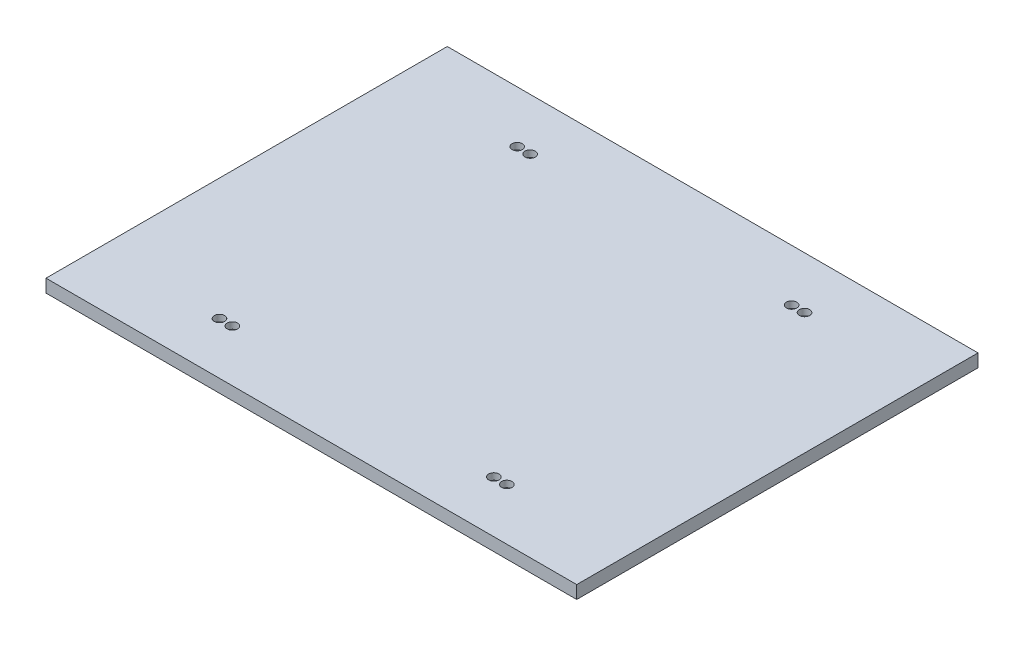
ISO-10303-21;
HEADER;
FILE_DESCRIPTION(('STEP AP214'),'2;1');
FILE_NAME('part.step','',(''),(''),'','','');
FILE_SCHEMA(('AUTOMOTIVE_DESIGN { 1 0 10303 214 1 1 1 1 }'));
ENDSEC;
DATA;
#1=APPLICATION_CONTEXT('core data for automotive mechanical design processes');
#2=APPLICATION_PROTOCOL_DEFINITION('international standard','automotive_design',2000,#1);
#3=PRODUCT_CONTEXT('',#1,'mechanical');
#4=PRODUCT('Part','Part','',(#3));
#5=PRODUCT_RELATED_PRODUCT_CATEGORY('part','',(#4));
#6=PRODUCT_DEFINITION_FORMATION('','',#4);
#7=PRODUCT_DEFINITION_CONTEXT('part definition',#1,'design');
#8=PRODUCT_DEFINITION('design','',#6,#7);
#9=PRODUCT_DEFINITION_SHAPE('','',#8);
#10=(LENGTH_UNIT() NAMED_UNIT(*) SI_UNIT(.MILLI.,.METRE.));
#11=(NAMED_UNIT(*) PLANE_ANGLE_UNIT() SI_UNIT($,.RADIAN.));
#12=(NAMED_UNIT(*) SI_UNIT($,.STERADIAN.) SOLID_ANGLE_UNIT());
#13=UNCERTAINTY_MEASURE_WITH_UNIT(LENGTH_MEASURE(1.E-05),#10,'distance_accuracy_value','');
#14=(GEOMETRIC_REPRESENTATION_CONTEXT(3) GLOBAL_UNCERTAINTY_ASSIGNED_CONTEXT((#13)) GLOBAL_UNIT_ASSIGNED_CONTEXT((#10,
#11,#12)) REPRESENTATION_CONTEXT('',''));
#15=CARTESIAN_POINT('',(0.,0.,0.));
#16=DIRECTION('',(0.,0.,1.));
#17=DIRECTION('',(1.,0.,0.));
#18=AXIS2_PLACEMENT_3D('',#15,#16,#17);
#19=CARTESIAN_POINT('',(94.,0.,-40.));
#20=DIRECTION('',(0.,1.,0.));
#21=DIRECTION('',(0.,0.,1.));
#22=AXIS2_PLACEMENT_3D('',#19,#20,#21);
#23=CYLINDRICAL_SURFACE('',#22,2.);
#24=CARTESIAN_POINT('',(94.,0.,-40.));
#25=DIRECTION('',(0.,1.,0.));
#26=DIRECTION('',(0.,0.,1.));
#27=AXIS2_PLACEMENT_3D('',#24,#25,#26);
#28=CIRCLE('',#27,2.);
#29=CARTESIAN_POINT('',(94.,0.,-38.));
#30=VERTEX_POINT('',#29);
#31=EDGE_CURVE('E612',#30,#30,#28,.T.);
#32=ORIENTED_EDGE('',*,*,#31,.F.);
#33=EDGE_LOOP('',(#32));
#34=FACE_BOUND('',#33,.T.);
#35=CARTESIAN_POINT('',(94.,5.,-40.));
#36=DIRECTION('',(0.,1.,0.));
#37=DIRECTION('',(0.,0.,1.));
#38=AXIS2_PLACEMENT_3D('',#35,#36,#37);
#39=CIRCLE('',#38,2.);
#40=CARTESIAN_POINT('',(94.,5.,-38.));
#41=VERTEX_POINT('',#40);
#42=EDGE_CURVE('E537',#41,#41,#39,.F.);
#43=ORIENTED_EDGE('',*,*,#42,.F.);
#44=EDGE_LOOP('',(#43));
#45=FACE_BOUND('',#44,.T.);
#46=ADVANCED_FACE('F532',(#34,#45),#23,.F.);
#47=CARTESIAN_POINT('',(94.,0.,-270.));
#48=DIRECTION('',(0.,1.,0.));
#49=DIRECTION('',(0.,0.,1.));
#50=AXIS2_PLACEMENT_3D('',#47,#48,#49);
#51=CYLINDRICAL_SURFACE('',#50,2.);
#52=CARTESIAN_POINT('',(94.,0.,-270.));
#53=DIRECTION('',(0.,1.,0.));
#54=DIRECTION('',(0.,0.,1.));
#55=AXIS2_PLACEMENT_3D('',#52,#53,#54);
#56=CIRCLE('',#55,2.);
#57=CARTESIAN_POINT('',(94.,0.,-268.));
#58=VERTEX_POINT('',#57);
#59=EDGE_CURVE('E654',#58,#58,#56,.T.);
#60=ORIENTED_EDGE('',*,*,#59,.F.);
#61=EDGE_LOOP('',(#60));
#62=FACE_BOUND('',#61,.T.);
#63=CARTESIAN_POINT('',(94.,5.,-270.));
#64=DIRECTION('',(0.,1.,0.));
#65=DIRECTION('',(0.,0.,1.));
#66=AXIS2_PLACEMENT_3D('',#63,#64,#65);
#67=CIRCLE('',#66,2.);
#68=CARTESIAN_POINT('',(94.,5.,-268.));
#69=VERTEX_POINT('',#68);
#70=EDGE_CURVE('E650',#69,#69,#67,.F.);
#71=ORIENTED_EDGE('',*,*,#70,.F.);
#72=EDGE_LOOP('',(#71));
#73=FACE_BOUND('',#72,.T.);
#74=ADVANCED_FACE('F810',(#62,#73),#51,.F.);
#75=CARTESIAN_POINT('',(104.,0.,-270.));
#76=DIRECTION('',(0.,1.,0.));
#77=DIRECTION('',(0.,0.,1.));
#78=AXIS2_PLACEMENT_3D('',#75,#76,#77);
#79=CYLINDRICAL_SURFACE('',#78,2.);
#80=CARTESIAN_POINT('',(104.,0.,-270.));
#81=DIRECTION('',(0.,1.,0.));
#82=DIRECTION('',(0.,0.,1.));
#83=AXIS2_PLACEMENT_3D('',#80,#81,#82);
#84=CIRCLE('',#83,2.);
#85=CARTESIAN_POINT('',(104.,0.,-268.));
#86=VERTEX_POINT('',#85);
#87=EDGE_CURVE('E662',#86,#86,#84,.T.);
#88=ORIENTED_EDGE('',*,*,#87,.F.);
#89=EDGE_LOOP('',(#88));
#90=FACE_BOUND('',#89,.T.);
#91=CARTESIAN_POINT('',(104.,5.,-270.));
#92=DIRECTION('',(0.,1.,0.));
#93=DIRECTION('',(0.,0.,1.));
#94=AXIS2_PLACEMENT_3D('',#91,#92,#93);
#95=CIRCLE('',#94,2.);
#96=CARTESIAN_POINT('',(104.,5.,-268.));
#97=VERTEX_POINT('',#96);
#98=EDGE_CURVE('E644',#97,#97,#95,.F.);
#99=ORIENTED_EDGE('',*,*,#98,.F.);
#100=EDGE_LOOP('',(#99));
#101=FACE_BOUND('',#100,.T.);
#102=ADVANCED_FACE('F812',(#90,#101),#79,.F.);
#103=CARTESIAN_POINT('',(306.,0.,-270.));
#104=DIRECTION('',(0.,1.,0.));
#105=DIRECTION('',(0.,0.,1.));
#106=AXIS2_PLACEMENT_3D('',#103,#104,#105);
#107=CYLINDRICAL_SURFACE('',#106,2.);
#108=CARTESIAN_POINT('',(306.,0.,-270.));
#109=DIRECTION('',(0.,1.,0.));
#110=DIRECTION('',(0.,0.,1.));
#111=AXIS2_PLACEMENT_3D('',#108,#109,#110);
#112=CIRCLE('',#111,2.);
#113=CARTESIAN_POINT('',(306.,0.,-268.));
#114=VERTEX_POINT('',#113);
#115=EDGE_CURVE('E669',#114,#114,#112,.T.);
#116=ORIENTED_EDGE('',*,*,#115,.F.);
#117=EDGE_LOOP('',(#116));
#118=FACE_BOUND('',#117,.T.);
#119=CARTESIAN_POINT('',(306.,5.,-270.));
#120=DIRECTION('',(0.,1.,0.));
#121=DIRECTION('',(0.,0.,1.));
#122=AXIS2_PLACEMENT_3D('',#119,#120,#121);
#123=CIRCLE('',#122,2.);
#124=CARTESIAN_POINT('',(306.,5.,-268.));
#125=VERTEX_POINT('',#124);
#126=EDGE_CURVE('E639',#125,#125,#123,.F.);
#127=ORIENTED_EDGE('',*,*,#126,.F.);
#128=EDGE_LOOP('',(#127));
#129=FACE_BOUND('',#128,.T.);
#130=ADVANCED_FACE('F857',(#118,#129),#107,.F.);
#131=CARTESIAN_POINT('',(316.,0.,-270.));
#132=DIRECTION('',(0.,1.,0.));
#133=DIRECTION('',(0.,0.,1.));
#134=AXIS2_PLACEMENT_3D('',#131,#132,#133);
#135=CYLINDRICAL_SURFACE('',#134,2.);
#136=CARTESIAN_POINT('',(316.,0.,-270.));
#137=DIRECTION('',(0.,1.,0.));
#138=DIRECTION('',(0.,0.,1.));
#139=AXIS2_PLACEMENT_3D('',#136,#137,#138);
#140=CIRCLE('',#139,2.);
#141=CARTESIAN_POINT('',(316.,0.,-268.));
#142=VERTEX_POINT('',#141);
#143=EDGE_CURVE('E685',#142,#142,#140,.T.);
#144=ORIENTED_EDGE('',*,*,#143,.F.);
#145=EDGE_LOOP('',(#144));
#146=FACE_BOUND('',#145,.T.);
#147=CARTESIAN_POINT('',(316.,5.,-270.));
#148=DIRECTION('',(0.,1.,0.));
#149=DIRECTION('',(0.,0.,1.));
#150=AXIS2_PLACEMENT_3D('',#147,#148,#149);
#151=CIRCLE('',#150,2.);
#152=CARTESIAN_POINT('',(316.,5.,-268.));
#153=VERTEX_POINT('',#152);
#154=EDGE_CURVE('E638',#153,#153,#151,.F.);
#155=ORIENTED_EDGE('',*,*,#154,.F.);
#156=EDGE_LOOP('',(#155));
#157=FACE_BOUND('',#156,.T.);
#158=ADVANCED_FACE('F819',(#146,#157),#135,.F.);
#159=CARTESIAN_POINT('',(316.,0.,-40.));
#160=DIRECTION('',(0.,1.,0.));
#161=DIRECTION('',(0.,0.,1.));
#162=AXIS2_PLACEMENT_3D('',#159,#160,#161);
#163=CYLINDRICAL_SURFACE('',#162,2.);
#164=CARTESIAN_POINT('',(316.,0.,-40.));
#165=DIRECTION('',(0.,1.,0.));
#166=DIRECTION('',(0.,0.,1.));
#167=AXIS2_PLACEMENT_3D('',#164,#165,#166);
#168=CIRCLE('',#167,2.);
#169=CARTESIAN_POINT('',(316.,0.,-38.));
#170=VERTEX_POINT('',#169);
#171=EDGE_CURVE('E678',#170,#170,#168,.T.);
#172=ORIENTED_EDGE('',*,*,#171,.F.);
#173=EDGE_LOOP('',(#172));
#174=FACE_BOUND('',#173,.T.);
#175=CARTESIAN_POINT('',(316.,5.,-40.));
#176=DIRECTION('',(0.,1.,0.));
#177=DIRECTION('',(0.,0.,1.));
#178=AXIS2_PLACEMENT_3D('',#175,#176,#177);
#179=CIRCLE('',#178,2.);
#180=CARTESIAN_POINT('',(316.,5.,-38.));
#181=VERTEX_POINT('',#180);
#182=EDGE_CURVE('E635',#181,#181,#179,.F.);
#183=ORIENTED_EDGE('',*,*,#182,.F.);
#184=EDGE_LOOP('',(#183));
#185=FACE_BOUND('',#184,.T.);
#186=ADVANCED_FACE('F848',(#174,#185),#163,.F.);
#187=CARTESIAN_POINT('',(306.,0.,-40.));
#188=DIRECTION('',(0.,1.,0.));
#189=DIRECTION('',(0.,0.,1.));
#190=AXIS2_PLACEMENT_3D('',#187,#188,#189);
#191=CYLINDRICAL_SURFACE('',#190,2.);
#192=CARTESIAN_POINT('',(306.,0.,-40.));
#193=DIRECTION('',(0.,1.,0.));
#194=DIRECTION('',(0.,0.,1.));
#195=AXIS2_PLACEMENT_3D('',#192,#193,#194);
#196=CIRCLE('',#195,2.);
#197=CARTESIAN_POINT('',(306.,0.,-38.));
#198=VERTEX_POINT('',#197);
#199=EDGE_CURVE('E677',#198,#198,#196,.T.);
#200=ORIENTED_EDGE('',*,*,#199,.F.);
#201=EDGE_LOOP('',(#200));
#202=FACE_BOUND('',#201,.T.);
#203=CARTESIAN_POINT('',(306.,5.,-40.));
#204=DIRECTION('',(0.,1.,0.));
#205=DIRECTION('',(0.,0.,1.));
#206=AXIS2_PLACEMENT_3D('',#203,#204,#205);
#207=CIRCLE('',#206,2.);
#208=CARTESIAN_POINT('',(306.,5.,-38.));
#209=VERTEX_POINT('',#208);
#210=EDGE_CURVE('E629',#209,#209,#207,.F.);
#211=ORIENTED_EDGE('',*,*,#210,.F.);
#212=EDGE_LOOP('',(#211));
#213=FACE_BOUND('',#212,.T.);
#214=ADVANCED_FACE('F838',(#202,#213),#191,.F.);
#215=CARTESIAN_POINT('',(104.,0.,-40.));
#216=DIRECTION('',(0.,1.,0.));
#217=DIRECTION('',(0.,0.,1.));
#218=AXIS2_PLACEMENT_3D('',#215,#216,#217);
#219=CYLINDRICAL_SURFACE('',#218,2.);
#220=CARTESIAN_POINT('',(104.,0.,-40.));
#221=DIRECTION('',(0.,1.,0.));
#222=DIRECTION('',(0.,0.,1.));
#223=AXIS2_PLACEMENT_3D('',#220,#221,#222);
#224=CIRCLE('',#223,2.);
#225=CARTESIAN_POINT('',(104.,0.,-38.));
#226=VERTEX_POINT('',#225);
#227=EDGE_CURVE('E675',#226,#226,#224,.T.);
#228=ORIENTED_EDGE('',*,*,#227,.F.);
#229=EDGE_LOOP('',(#228));
#230=FACE_BOUND('',#229,.T.);
#231=CARTESIAN_POINT('',(104.,5.,-40.));
#232=DIRECTION('',(0.,1.,0.));
#233=DIRECTION('',(0.,0.,1.));
#234=AXIS2_PLACEMENT_3D('',#231,#232,#233);
#235=CIRCLE('',#234,2.);
#236=CARTESIAN_POINT('',(104.,5.,-38.));
#237=VERTEX_POINT('',#236);
#238=EDGE_CURVE('E621',#237,#237,#235,.F.);
#239=ORIENTED_EDGE('',*,*,#238,.F.);
#240=EDGE_LOOP('',(#239));
#241=FACE_BOUND('',#240,.T.);
#242=ADVANCED_FACE('F834',(#230,#241),#219,.F.);
#243=CARTESIAN_POINT('',(0.,10.,0.));
#244=DIRECTION('',(1.,0.,0.));
#245=DIRECTION('',(0.,0.,-1.));
#246=AXIS2_PLACEMENT_3D('',#243,#244,#245);
#247=PLANE('',#246);
#248=DIRECTION('',(0.,0.,1.));
#249=VECTOR('',#248,1.);
#250=CARTESIAN_POINT('',(0.,0.,0.));
#251=LINE('',#250,#249);
#252=CARTESIAN_POINT('',(0.,0.,-310.));
#253=VERTEX_POINT('',#252);
#254=CARTESIAN_POINT('',(0.,0.,0.));
#255=VERTEX_POINT('',#254);
#256=EDGE_CURVE('E609',#253,#255,#251,.T.);
#257=ORIENTED_EDGE('',*,*,#256,.T.);
#258=DIRECTION('',(0.,-1.,0.));
#259=VECTOR('',#258,1.);
#260=CARTESIAN_POINT('',(0.,10.,0.));
#261=LINE('',#260,#259);
#262=CARTESIAN_POINT('',(0.,10.,0.));
#263=VERTEX_POINT('',#262);
#264=EDGE_CURVE('E12',#263,#255,#261,.T.);
#265=ORIENTED_EDGE('',*,*,#264,.F.);
#266=DIRECTION('',(0.,0.,1.));
#267=VECTOR('',#266,1.);
#268=CARTESIAN_POINT('',(0.,10.,0.));
#269=LINE('',#268,#267);
#270=CARTESIAN_POINT('',(0.,10.,-310.));
#271=VERTEX_POINT('',#270);
#272=EDGE_CURVE('E587',#271,#263,#269,.T.);
#273=ORIENTED_EDGE('',*,*,#272,.F.);
#274=DIRECTION('',(0.,-1.,0.));
#275=VECTOR('',#274,1.);
#276=CARTESIAN_POINT('',(0.,10.,-310.));
#277=LINE('',#276,#275);
#278=EDGE_CURVE('E603',#271,#253,#277,.T.);
#279=ORIENTED_EDGE('',*,*,#278,.T.);
#280=EDGE_LOOP('',(#257,#265,#273,#279));
#281=FACE_BOUND('',#280,.T.);
#282=ADVANCED_FACE('F540',(#281),#247,.F.);
#283=CARTESIAN_POINT('',(0.,10.,0.));
#284=DIRECTION('',(0.,0.,-1.));
#285=DIRECTION('',(-1.,0.,0.));
#286=AXIS2_PLACEMENT_3D('',#283,#284,#285);
#287=PLANE('',#286);
#288=DIRECTION('',(1.,0.,0.));
#289=VECTOR('',#288,1.);
#290=CARTESIAN_POINT('',(0.,0.,0.));
#291=LINE('',#290,#289);
#292=CARTESIAN_POINT('',(410.,0.,0.));
#293=VERTEX_POINT('',#292);
#294=EDGE_CURVE('E594',#255,#293,#291,.T.);
#295=ORIENTED_EDGE('',*,*,#294,.T.);
#296=DIRECTION('',(0.,-1.,0.));
#297=VECTOR('',#296,1.);
#298=CARTESIAN_POINT('',(410.,10.,0.));
#299=LINE('',#298,#297);
#300=CARTESIAN_POINT('',(410.,10.,0.));
#301=VERTEX_POINT('',#300);
#302=EDGE_CURVE('E546',#301,#293,#299,.T.);
#303=ORIENTED_EDGE('',*,*,#302,.F.);
#304=DIRECTION('',(1.,0.,0.));
#305=VECTOR('',#304,1.);
#306=CARTESIAN_POINT('',(0.,10.,0.));
#307=LINE('',#306,#305);
#308=EDGE_CURVE('E584',#263,#301,#307,.T.);
#309=ORIENTED_EDGE('',*,*,#308,.F.);
#310=ORIENTED_EDGE('',*,*,#264,.T.);
#311=EDGE_LOOP('',(#295,#303,#309,#310));
#312=FACE_BOUND('',#311,.T.);
#313=ADVANCED_FACE('F592',(#312),#287,.F.);
#314=CARTESIAN_POINT('',(410.,10.,0.));
#315=DIRECTION('',(-1.,0.,0.));
#316=DIRECTION('',(0.,0.,1.));
#317=AXIS2_PLACEMENT_3D('',#314,#315,#316);
#318=PLANE('',#317);
#319=DIRECTION('',(0.,0.,-1.));
#320=VECTOR('',#319,1.);
#321=CARTESIAN_POINT('',(410.,0.,0.));
#322=LINE('',#321,#320);
#323=CARTESIAN_POINT('',(410.,0.,-310.));
#324=VERTEX_POINT('',#323);
#325=EDGE_CURVE('E574',#293,#324,#322,.T.);
#326=ORIENTED_EDGE('',*,*,#325,.T.);
#327=DIRECTION('',(0.,-1.,0.));
#328=VECTOR('',#327,1.);
#329=CARTESIAN_POINT('',(410.,10.,-310.));
#330=LINE('',#329,#328);
#331=CARTESIAN_POINT('',(410.,10.,-310.));
#332=VERTEX_POINT('',#331);
#333=EDGE_CURVE('E600',#332,#324,#330,.T.);
#334=ORIENTED_EDGE('',*,*,#333,.F.);
#335=DIRECTION('',(0.,0.,-1.));
#336=VECTOR('',#335,1.);
#337=CARTESIAN_POINT('',(410.,10.,0.));
#338=LINE('',#337,#336);
#339=EDGE_CURVE('E586',#301,#332,#338,.T.);
#340=ORIENTED_EDGE('',*,*,#339,.F.);
#341=ORIENTED_EDGE('',*,*,#302,.T.);
#342=EDGE_LOOP('',(#326,#334,#340,#341));
#343=FACE_BOUND('',#342,.T.);
#344=ADVANCED_FACE('F597',(#343),#318,.F.);
#345=CARTESIAN_POINT('',(0.,10.,-310.));
#346=DIRECTION('',(0.,0.,1.));
#347=DIRECTION('',(1.,0.,0.));
#348=AXIS2_PLACEMENT_3D('',#345,#346,#347);
#349=PLANE('',#348);
#350=DIRECTION('',(-1.,0.,0.));
#351=VECTOR('',#350,1.);
#352=CARTESIAN_POINT('',(0.,0.,-310.));
#353=LINE('',#352,#351);
#354=EDGE_CURVE('E578',#324,#253,#353,.T.);
#355=ORIENTED_EDGE('',*,*,#354,.T.);
#356=ORIENTED_EDGE('',*,*,#278,.F.);
#357=DIRECTION('',(-1.,0.,0.));
#358=VECTOR('',#357,1.);
#359=CARTESIAN_POINT('',(0.,10.,-310.));
#360=LINE('',#359,#358);
#361=EDGE_CURVE('E553',#332,#271,#360,.T.);
#362=ORIENTED_EDGE('',*,*,#361,.F.);
#363=ORIENTED_EDGE('',*,*,#333,.T.);
#364=EDGE_LOOP('',(#355,#356,#362,#363));
#365=FACE_BOUND('',#364,.T.);
#366=ADVANCED_FACE('F778',(#365),#349,.F.);
#367=CARTESIAN_POINT('',(0.,10.,0.));
#368=DIRECTION('',(0.,-1.,0.));
#369=DIRECTION('',(0.,0.,-1.));
#370=AXIS2_PLACEMENT_3D('',#367,#368,#369);
#371=PLANE('',#370);
#372=CARTESIAN_POINT('',(306.,10.,-40.));
#373=DIRECTION('',(0.,1.,0.));
#374=DIRECTION('',(0.,0.,1.));
#375=AXIS2_PLACEMENT_3D('',#372,#373,#374);
#376=CIRCLE('',#375,3.99999999999999);
#377=CARTESIAN_POINT('',(306.,10.,-36.));
#378=VERTEX_POINT('',#377);
#379=EDGE_CURVE('E739',#378,#378,#376,.T.);
#380=ORIENTED_EDGE('',*,*,#379,.F.);
#381=EDGE_LOOP('',(#380));
#382=FACE_BOUND('',#381,.T.);
#383=CARTESIAN_POINT('',(316.,10.,-270.));
#384=DIRECTION('',(0.,1.,0.));
#385=DIRECTION('',(0.,0.,1.));
#386=AXIS2_PLACEMENT_3D('',#383,#384,#385);
#387=CIRCLE('',#386,3.99999999999999);
#388=CARTESIAN_POINT('',(316.,10.,-266.));
#389=VERTEX_POINT('',#388);
#390=EDGE_CURVE('E722',#389,#389,#387,.T.);
#391=ORIENTED_EDGE('',*,*,#390,.F.);
#392=EDGE_LOOP('',(#391));
#393=FACE_BOUND('',#392,.T.);
#394=CARTESIAN_POINT('',(306.,10.,-270.));
#395=DIRECTION('',(0.,1.,0.));
#396=DIRECTION('',(0.,0.,1.));
#397=AXIS2_PLACEMENT_3D('',#394,#395,#396);
#398=CIRCLE('',#397,3.99999999999999);
#399=CARTESIAN_POINT('',(306.,10.,-266.));
#400=VERTEX_POINT('',#399);
#401=EDGE_CURVE('E721',#400,#400,#398,.T.);
#402=ORIENTED_EDGE('',*,*,#401,.F.);
#403=EDGE_LOOP('',(#402));
#404=FACE_BOUND('',#403,.T.);
#405=CARTESIAN_POINT('',(104.,10.,-270.));
#406=DIRECTION('',(0.,1.,0.));
#407=DIRECTION('',(0.,0.,1.));
#408=AXIS2_PLACEMENT_3D('',#405,#406,#407);
#409=CIRCLE('',#408,4.00000000000001);
#410=CARTESIAN_POINT('',(104.,10.,-266.));
#411=VERTEX_POINT('',#410);
#412=EDGE_CURVE('E712',#411,#411,#409,.T.);
#413=ORIENTED_EDGE('',*,*,#412,.F.);
#414=EDGE_LOOP('',(#413));
#415=FACE_BOUND('',#414,.T.);
#416=CARTESIAN_POINT('',(104.,10.,-40.));
#417=DIRECTION('',(0.,1.,0.));
#418=DIRECTION('',(0.,0.,1.));
#419=AXIS2_PLACEMENT_3D('',#416,#417,#418);
#420=CIRCLE('',#419,4.00000000000001);
#421=CARTESIAN_POINT('',(104.,10.,-36.));
#422=VERTEX_POINT('',#421);
#423=EDGE_CURVE('E754',#422,#422,#420,.T.);
#424=ORIENTED_EDGE('',*,*,#423,.F.);
#425=EDGE_LOOP('',(#424));
#426=FACE_BOUND('',#425,.T.);
#427=CARTESIAN_POINT('',(94.,10.,-40.));
#428=DIRECTION('',(0.,1.,0.));
#429=DIRECTION('',(0.,0.,1.));
#430=AXIS2_PLACEMENT_3D('',#427,#428,#429);
#431=CIRCLE('',#430,4.00000000000001);
#432=CARTESIAN_POINT('',(94.,10.,-36.));
#433=VERTEX_POINT('',#432);
#434=EDGE_CURVE('E751',#433,#433,#431,.T.);
#435=ORIENTED_EDGE('',*,*,#434,.F.);
#436=EDGE_LOOP('',(#435));
#437=FACE_BOUND('',#436,.T.);
#438=CARTESIAN_POINT('',(316.,10.,-40.));
#439=DIRECTION('',(0.,1.,0.));
#440=DIRECTION('',(0.,0.,1.));
#441=AXIS2_PLACEMENT_3D('',#438,#439,#440);
#442=CIRCLE('',#441,3.99999999999999);
#443=CARTESIAN_POINT('',(316.,10.,-36.));
#444=VERTEX_POINT('',#443);
#445=EDGE_CURVE('E737',#444,#444,#442,.T.);
#446=ORIENTED_EDGE('',*,*,#445,.F.);
#447=EDGE_LOOP('',(#446));
#448=FACE_BOUND('',#447,.T.);
#449=CARTESIAN_POINT('',(94.,10.,-270.));
#450=DIRECTION('',(0.,1.,0.));
#451=DIRECTION('',(0.,0.,1.));
#452=AXIS2_PLACEMENT_3D('',#449,#450,#451);
#453=CIRCLE('',#452,4.00000000000001);
#454=CARTESIAN_POINT('',(94.,10.,-266.));
#455=VERTEX_POINT('',#454);
#456=EDGE_CURVE('E707',#455,#455,#453,.T.);
#457=ORIENTED_EDGE('',*,*,#456,.F.);
#458=EDGE_LOOP('',(#457));
#459=FACE_BOUND('',#458,.T.);
#460=ORIENTED_EDGE('',*,*,#272,.T.);
#461=ORIENTED_EDGE('',*,*,#308,.T.);
#462=ORIENTED_EDGE('',*,*,#339,.T.);
#463=ORIENTED_EDGE('',*,*,#361,.T.);
#464=EDGE_LOOP('',(#460,#461,#462,#463));
#465=FACE_BOUND('',#464,.T.);
#466=ADVANCED_FACE('F588',(#382,#393,#404,#415,#426,#437,#448,#459,#465),#371,.F.);
#467=CARTESIAN_POINT('',(0.,0.,0.));
#468=DIRECTION('',(0.,-1.,0.));
#469=DIRECTION('',(0.,0.,-1.));
#470=AXIS2_PLACEMENT_3D('',#467,#468,#469);
#471=PLANE('',#470);
#472=ORIENTED_EDGE('',*,*,#227,.T.);
#473=EDGE_LOOP('',(#472));
#474=FACE_BOUND('',#473,.T.);
#475=ORIENTED_EDGE('',*,*,#199,.T.);
#476=EDGE_LOOP('',(#475));
#477=FACE_BOUND('',#476,.T.);
#478=ORIENTED_EDGE('',*,*,#171,.T.);
#479=EDGE_LOOP('',(#478));
#480=FACE_BOUND('',#479,.T.);
#481=ORIENTED_EDGE('',*,*,#143,.T.);
#482=EDGE_LOOP('',(#481));
#483=FACE_BOUND('',#482,.T.);
#484=ORIENTED_EDGE('',*,*,#115,.T.);
#485=EDGE_LOOP('',(#484));
#486=FACE_BOUND('',#485,.T.);
#487=ORIENTED_EDGE('',*,*,#87,.T.);
#488=EDGE_LOOP('',(#487));
#489=FACE_BOUND('',#488,.T.);
#490=ORIENTED_EDGE('',*,*,#59,.T.);
#491=EDGE_LOOP('',(#490));
#492=FACE_BOUND('',#491,.T.);
#493=ORIENTED_EDGE('',*,*,#31,.T.);
#494=EDGE_LOOP('',(#493));
#495=FACE_BOUND('',#494,.T.);
#496=ORIENTED_EDGE('',*,*,#256,.F.);
#497=ORIENTED_EDGE('',*,*,#354,.F.);
#498=ORIENTED_EDGE('',*,*,#325,.F.);
#499=ORIENTED_EDGE('',*,*,#294,.F.);
#500=EDGE_LOOP('',(#496,#497,#498,#499));
#501=FACE_BOUND('',#500,.T.);
#502=ADVANCED_FACE('F779',(#474,#477,#480,#483,#486,#489,#492,#495,#501),#471,.T.);
#503=CARTESIAN_POINT('',(104.,5.,-40.));
#504=DIRECTION('',(0.,1.,0.));
#505=DIRECTION('',(0.,0.,1.));
#506=AXIS2_PLACEMENT_3D('',#503,#504,#505);
#507=PLANE('',#506);
#508=CARTESIAN_POINT('',(104.,5.,-40.));
#509=DIRECTION('',(0.,1.,0.));
#510=DIRECTION('',(0.,0.,1.));
#511=AXIS2_PLACEMENT_3D('',#508,#509,#510);
#512=CIRCLE('',#511,4.00000000000001);
#513=CARTESIAN_POINT('',(104.,5.,-36.));
#514=VERTEX_POINT('',#513);
#515=EDGE_CURVE('E764',#514,#514,#512,.T.);
#516=ORIENTED_EDGE('',*,*,#515,.T.);
#517=EDGE_LOOP('',(#516));
#518=FACE_BOUND('',#517,.T.);
#519=ORIENTED_EDGE('',*,*,#238,.T.);
#520=EDGE_LOOP('',(#519));
#521=FACE_BOUND('',#520,.T.);
#522=ADVANCED_FACE('F823',(#518,#521),#507,.T.);
#523=CARTESIAN_POINT('',(104.,5.,-40.));
#524=DIRECTION('',(0.,1.,0.));
#525=DIRECTION('',(0.,0.,1.));
#526=AXIS2_PLACEMENT_3D('',#523,#524,#525);
#527=CYLINDRICAL_SURFACE('',#526,4.00000000000001);
#528=ORIENTED_EDGE('',*,*,#515,.F.);
#529=EDGE_LOOP('',(#528));
#530=FACE_BOUND('',#529,.T.);
#531=ORIENTED_EDGE('',*,*,#423,.T.);
#532=EDGE_LOOP('',(#531));
#533=FACE_BOUND('',#532,.T.);
#534=ADVANCED_FACE('F771',(#530,#533),#527,.F.);
#535=CARTESIAN_POINT('',(306.,5.,-40.));
#536=DIRECTION('',(0.,1.,0.));
#537=DIRECTION('',(0.,0.,1.));
#538=AXIS2_PLACEMENT_3D('',#535,#536,#537);
#539=PLANE('',#538);
#540=CARTESIAN_POINT('',(306.,5.,-40.));
#541=DIRECTION('',(0.,1.,0.));
#542=DIRECTION('',(0.,0.,1.));
#543=AXIS2_PLACEMENT_3D('',#540,#541,#542);
#544=CIRCLE('',#543,3.99999999999999);
#545=CARTESIAN_POINT('',(306.,5.,-36.));
#546=VERTEX_POINT('',#545);
#547=EDGE_CURVE('E731',#546,#546,#544,.T.);
#548=ORIENTED_EDGE('',*,*,#547,.T.);
#549=EDGE_LOOP('',(#548));
#550=FACE_BOUND('',#549,.T.);
#551=ORIENTED_EDGE('',*,*,#210,.T.);
#552=EDGE_LOOP('',(#551));
#553=FACE_BOUND('',#552,.T.);
#554=ADVANCED_FACE('F876',(#550,#553),#539,.T.);
#555=CARTESIAN_POINT('',(306.,5.,-40.));
#556=DIRECTION('',(0.,1.,0.));
#557=DIRECTION('',(0.,0.,1.));
#558=AXIS2_PLACEMENT_3D('',#555,#556,#557);
#559=CYLINDRICAL_SURFACE('',#558,3.99999999999999);
#560=ORIENTED_EDGE('',*,*,#547,.F.);
#561=EDGE_LOOP('',(#560));
#562=FACE_BOUND('',#561,.T.);
#563=ORIENTED_EDGE('',*,*,#379,.T.);
#564=EDGE_LOOP('',(#563));
#565=FACE_BOUND('',#564,.T.);
#566=ADVANCED_FACE('F866',(#562,#565),#559,.F.);
#567=CARTESIAN_POINT('',(316.,5.,-40.));
#568=DIRECTION('',(0.,1.,0.));
#569=DIRECTION('',(0.,0.,1.));
#570=AXIS2_PLACEMENT_3D('',#567,#568,#569);
#571=PLANE('',#570);
#572=CARTESIAN_POINT('',(316.,5.,-40.));
#573=DIRECTION('',(0.,1.,0.));
#574=DIRECTION('',(0.,0.,1.));
#575=AXIS2_PLACEMENT_3D('',#572,#573,#574);
#576=CIRCLE('',#575,3.99999999999999);
#577=CARTESIAN_POINT('',(316.,5.,-36.));
#578=VERTEX_POINT('',#577);
#579=EDGE_CURVE('E758',#578,#578,#576,.T.);
#580=ORIENTED_EDGE('',*,*,#579,.T.);
#581=EDGE_LOOP('',(#580));
#582=FACE_BOUND('',#581,.T.);
#583=ORIENTED_EDGE('',*,*,#182,.T.);
#584=EDGE_LOOP('',(#583));
#585=FACE_BOUND('',#584,.T.);
#586=ADVANCED_FACE('F861',(#582,#585),#571,.T.);
#587=CARTESIAN_POINT('',(316.,5.,-40.));
#588=DIRECTION('',(0.,1.,0.));
#589=DIRECTION('',(0.,0.,1.));
#590=AXIS2_PLACEMENT_3D('',#587,#588,#589);
#591=CYLINDRICAL_SURFACE('',#590,3.99999999999999);
#592=ORIENTED_EDGE('',*,*,#579,.F.);
#593=EDGE_LOOP('',(#592));
#594=FACE_BOUND('',#593,.T.);
#595=ORIENTED_EDGE('',*,*,#445,.T.);
#596=EDGE_LOOP('',(#595));
#597=FACE_BOUND('',#596,.T.);
#598=ADVANCED_FACE('F862',(#594,#597),#591,.F.);
#599=CARTESIAN_POINT('',(316.,5.,-270.));
#600=DIRECTION('',(0.,1.,0.));
#601=DIRECTION('',(0.,0.,1.));
#602=AXIS2_PLACEMENT_3D('',#599,#600,#601);
#603=PLANE('',#602);
#604=CARTESIAN_POINT('',(316.,5.,-270.));
#605=DIRECTION('',(0.,1.,0.));
#606=DIRECTION('',(0.,0.,1.));
#607=AXIS2_PLACEMENT_3D('',#604,#605,#606);
#608=CIRCLE('',#607,3.99999999999999);
#609=CARTESIAN_POINT('',(316.,5.,-266.));
#610=VERTEX_POINT('',#609);
#611=EDGE_CURVE('E745',#610,#610,#608,.T.);
#612=ORIENTED_EDGE('',*,*,#611,.T.);
#613=EDGE_LOOP('',(#612));
#614=FACE_BOUND('',#613,.T.);
#615=ORIENTED_EDGE('',*,*,#154,.T.);
#616=EDGE_LOOP('',(#615));
#617=FACE_BOUND('',#616,.T.);
#618=ADVANCED_FACE('F873',(#614,#617),#603,.T.);
#619=CARTESIAN_POINT('',(316.,5.,-270.));
#620=DIRECTION('',(0.,1.,0.));
#621=DIRECTION('',(0.,0.,1.));
#622=AXIS2_PLACEMENT_3D('',#619,#620,#621);
#623=CYLINDRICAL_SURFACE('',#622,3.99999999999999);
#624=ORIENTED_EDGE('',*,*,#611,.F.);
#625=EDGE_LOOP('',(#624));
#626=FACE_BOUND('',#625,.T.);
#627=ORIENTED_EDGE('',*,*,#390,.T.);
#628=EDGE_LOOP('',(#627));
#629=FACE_BOUND('',#628,.T.);
#630=ADVANCED_FACE('F881',(#626,#629),#623,.F.);
#631=CARTESIAN_POINT('',(306.,5.,-270.));
#632=DIRECTION('',(0.,1.,0.));
#633=DIRECTION('',(0.,0.,1.));
#634=AXIS2_PLACEMENT_3D('',#631,#632,#633);
#635=PLANE('',#634);
#636=CARTESIAN_POINT('',(306.,5.,-270.));
#637=DIRECTION('',(0.,1.,0.));
#638=DIRECTION('',(0.,0.,1.));
#639=AXIS2_PLACEMENT_3D('',#636,#637,#638);
#640=CIRCLE('',#639,3.99999999999999);
#641=CARTESIAN_POINT('',(306.,5.,-266.));
#642=VERTEX_POINT('',#641);
#643=EDGE_CURVE('E720',#642,#642,#640,.T.);
#644=ORIENTED_EDGE('',*,*,#643,.T.);
#645=EDGE_LOOP('',(#644));
#646=FACE_BOUND('',#645,.T.);
#647=ORIENTED_EDGE('',*,*,#126,.T.);
#648=EDGE_LOOP('',(#647));
#649=FACE_BOUND('',#648,.T.);
#650=ADVANCED_FACE('F887',(#646,#649),#635,.T.);
#651=CARTESIAN_POINT('',(306.,5.,-270.));
#652=DIRECTION('',(0.,1.,0.));
#653=DIRECTION('',(0.,0.,1.));
#654=AXIS2_PLACEMENT_3D('',#651,#652,#653);
#655=CYLINDRICAL_SURFACE('',#654,3.99999999999999);
#656=ORIENTED_EDGE('',*,*,#643,.F.);
#657=EDGE_LOOP('',(#656));
#658=FACE_BOUND('',#657,.T.);
#659=ORIENTED_EDGE('',*,*,#401,.T.);
#660=EDGE_LOOP('',(#659));
#661=FACE_BOUND('',#660,.T.);
#662=ADVANCED_FACE('F903',(#658,#661),#655,.F.);
#663=CARTESIAN_POINT('',(104.,5.,-270.));
#664=DIRECTION('',(0.,1.,0.));
#665=DIRECTION('',(0.,0.,1.));
#666=AXIS2_PLACEMENT_3D('',#663,#664,#665);
#667=PLANE('',#666);
#668=CARTESIAN_POINT('',(104.,5.,-270.));
#669=DIRECTION('',(0.,1.,0.));
#670=DIRECTION('',(0.,0.,1.));
#671=AXIS2_PLACEMENT_3D('',#668,#669,#670);
#672=CIRCLE('',#671,4.00000000000001);
#673=CARTESIAN_POINT('',(104.,5.,-266.));
#674=VERTEX_POINT('',#673);
#675=EDGE_CURVE('E726',#674,#674,#672,.T.);
#676=ORIENTED_EDGE('',*,*,#675,.T.);
#677=EDGE_LOOP('',(#676));
#678=FACE_BOUND('',#677,.T.);
#679=ORIENTED_EDGE('',*,*,#98,.T.);
#680=EDGE_LOOP('',(#679));
#681=FACE_BOUND('',#680,.T.);
#682=ADVANCED_FACE('F900',(#678,#681),#667,.T.);
#683=CARTESIAN_POINT('',(104.,5.,-270.));
#684=DIRECTION('',(0.,1.,0.));
#685=DIRECTION('',(0.,0.,1.));
#686=AXIS2_PLACEMENT_3D('',#683,#684,#685);
#687=CYLINDRICAL_SURFACE('',#686,4.00000000000001);
#688=ORIENTED_EDGE('',*,*,#675,.F.);
#689=EDGE_LOOP('',(#688));
#690=FACE_BOUND('',#689,.T.);
#691=ORIENTED_EDGE('',*,*,#412,.T.);
#692=EDGE_LOOP('',(#691));
#693=FACE_BOUND('',#692,.T.);
#694=ADVANCED_FACE('F803',(#690,#693),#687,.F.);
#695=CARTESIAN_POINT('',(94.,5.,-270.));
#696=DIRECTION('',(0.,1.,0.));
#697=DIRECTION('',(0.,0.,1.));
#698=AXIS2_PLACEMENT_3D('',#695,#696,#697);
#699=PLANE('',#698);
#700=CARTESIAN_POINT('',(94.,5.,-270.));
#701=DIRECTION('',(0.,1.,0.));
#702=DIRECTION('',(0.,0.,1.));
#703=AXIS2_PLACEMENT_3D('',#700,#701,#702);
#704=CIRCLE('',#703,4.00000000000001);
#705=CARTESIAN_POINT('',(94.,5.,-266.));
#706=VERTEX_POINT('',#705);
#707=EDGE_CURVE('E627',#706,#706,#704,.T.);
#708=ORIENTED_EDGE('',*,*,#707,.T.);
#709=EDGE_LOOP('',(#708));
#710=FACE_BOUND('',#709,.T.);
#711=ORIENTED_EDGE('',*,*,#70,.T.);
#712=EDGE_LOOP('',(#711));
#713=FACE_BOUND('',#712,.T.);
#714=ADVANCED_FACE('F793',(#710,#713),#699,.T.);
#715=CARTESIAN_POINT('',(94.,5.,-270.));
#716=DIRECTION('',(0.,1.,0.));
#717=DIRECTION('',(0.,0.,1.));
#718=AXIS2_PLACEMENT_3D('',#715,#716,#717);
#719=CYLINDRICAL_SURFACE('',#718,4.00000000000001);
#720=ORIENTED_EDGE('',*,*,#707,.F.);
#721=EDGE_LOOP('',(#720));
#722=FACE_BOUND('',#721,.T.);
#723=ORIENTED_EDGE('',*,*,#456,.T.);
#724=EDGE_LOOP('',(#723));
#725=FACE_BOUND('',#724,.T.);
#726=ADVANCED_FACE('F786',(#722,#725),#719,.F.);
#727=CARTESIAN_POINT('',(94.,5.,-40.));
#728=DIRECTION('',(0.,1.,0.));
#729=DIRECTION('',(0.,0.,1.));
#730=AXIS2_PLACEMENT_3D('',#727,#728,#729);
#731=PLANE('',#730);
#732=CARTESIAN_POINT('',(94.,5.,-40.));
#733=DIRECTION('',(0.,1.,0.));
#734=DIRECTION('',(0.,0.,1.));
#735=AXIS2_PLACEMENT_3D('',#732,#733,#734);
#736=CIRCLE('',#735,4.00000000000001);
#737=CARTESIAN_POINT('',(94.,5.,-36.));
#738=VERTEX_POINT('',#737);
#739=EDGE_CURVE('E750',#738,#738,#736,.T.);
#740=ORIENTED_EDGE('',*,*,#739,.T.);
#741=EDGE_LOOP('',(#740));
#742=FACE_BOUND('',#741,.T.);
#743=ORIENTED_EDGE('',*,*,#42,.T.);
#744=EDGE_LOOP('',(#743));
#745=FACE_BOUND('',#744,.T.);
#746=ADVANCED_FACE('F788',(#742,#745),#731,.T.);
#747=CARTESIAN_POINT('',(94.,5.,-40.));
#748=DIRECTION('',(0.,1.,0.));
#749=DIRECTION('',(0.,0.,1.));
#750=AXIS2_PLACEMENT_3D('',#747,#748,#749);
#751=CYLINDRICAL_SURFACE('',#750,4.00000000000001);
#752=ORIENTED_EDGE('',*,*,#739,.F.);
#753=EDGE_LOOP('',(#752));
#754=FACE_BOUND('',#753,.T.);
#755=ORIENTED_EDGE('',*,*,#434,.T.);
#756=EDGE_LOOP('',(#755));
#757=FACE_BOUND('',#756,.T.);
#758=ADVANCED_FACE('F798',(#754,#757),#751,.F.);
#759=CLOSED_SHELL('',(#46,#74,#102,#130,#158,#186,#214,#242,#282,#313,#344,#366,#466,#502,#522,
#534,#554,#566,#586,#598,#618,#630,#650,#662,#682,#694,#714,#726,#746,#758));
#760=MANIFOLD_SOLID_BREP('B2',#759);
#761=ADVANCED_BREP_SHAPE_REPRESENTATION('',(#18,#760),#14);
#762=SHAPE_DEFINITION_REPRESENTATION(#9,#761);
ENDSEC;
END-ISO-10303-21;
